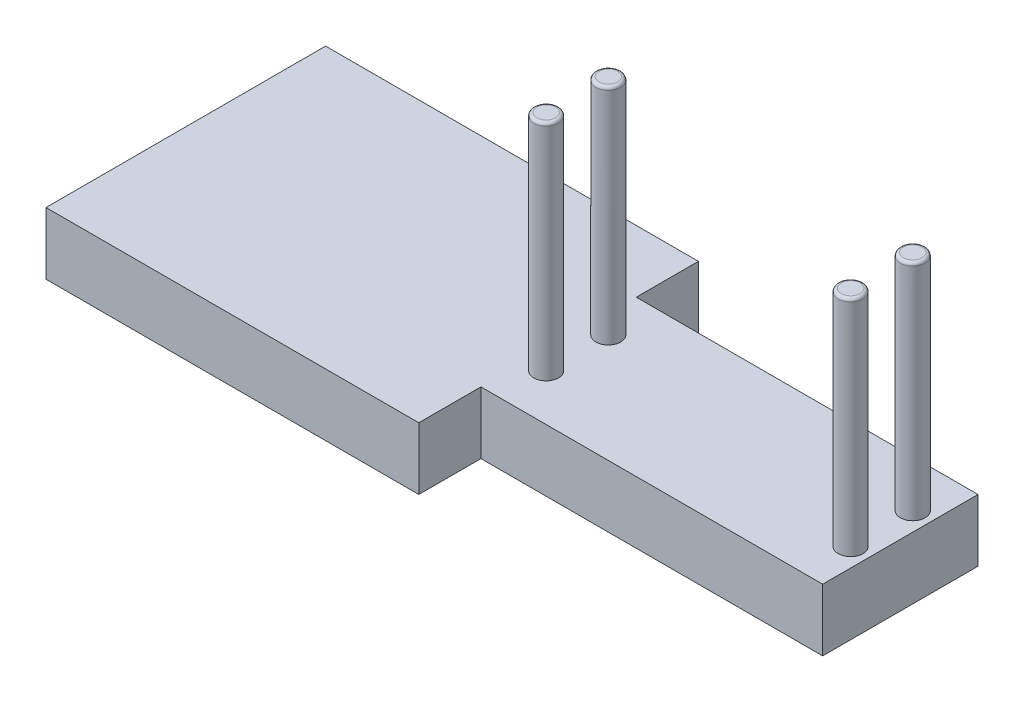
ISO-10303-21;
HEADER;
FILE_DESCRIPTION(('STEP AP214'),'2;1');
FILE_NAME('part.step','',(''),(''),'','','');
FILE_SCHEMA(('AUTOMOTIVE_DESIGN { 1 0 10303 214 1 1 1 1 }'));
ENDSEC;
DATA;
#1=APPLICATION_CONTEXT('core data for automotive mechanical design processes');
#2=APPLICATION_PROTOCOL_DEFINITION('international standard','automotive_design',2000,#1);
#3=PRODUCT_CONTEXT('',#1,'mechanical');
#4=PRODUCT('Part','Part','',(#3));
#5=PRODUCT_RELATED_PRODUCT_CATEGORY('part','',(#4));
#6=PRODUCT_DEFINITION_FORMATION('','',#4);
#7=PRODUCT_DEFINITION_CONTEXT('part definition',#1,'design');
#8=PRODUCT_DEFINITION('design','',#6,#7);
#9=PRODUCT_DEFINITION_SHAPE('','',#8);
#10=(LENGTH_UNIT() NAMED_UNIT(*) SI_UNIT(.MILLI.,.METRE.));
#11=(NAMED_UNIT(*) PLANE_ANGLE_UNIT() SI_UNIT($,.RADIAN.));
#12=(NAMED_UNIT(*) SI_UNIT($,.STERADIAN.) SOLID_ANGLE_UNIT());
#13=UNCERTAINTY_MEASURE_WITH_UNIT(LENGTH_MEASURE(1.E-05),#10,'distance_accuracy_value','');
#14=(GEOMETRIC_REPRESENTATION_CONTEXT(3) GLOBAL_UNCERTAINTY_ASSIGNED_CONTEXT((#13)) GLOBAL_UNIT_ASSIGNED_CONTEXT((#10,
#11,#12)) REPRESENTATION_CONTEXT('',''));
#15=CARTESIAN_POINT('',(0.,0.,0.));
#16=DIRECTION('',(0.,0.,1.));
#17=DIRECTION('',(1.,0.,0.));
#18=AXIS2_PLACEMENT_3D('',#15,#16,#17);
#19=CARTESIAN_POINT('',(-30.,10.,22.5));
#20=DIRECTION('',(0.,0.,-1.));
#21=DIRECTION('',(-1.,0.,0.));
#22=AXIS2_PLACEMENT_3D('',#19,#20,#21);
#23=PLANE('',#22);
#24=DIRECTION('',(1.,0.,0.));
#25=VECTOR('',#24,1.);
#26=CARTESIAN_POINT('',(-30.,0.,22.5));
#27=LINE('',#26,#25);
#28=CARTESIAN_POINT('',(-30.,0.,22.5));
#29=VERTEX_POINT('',#28);
#30=CARTESIAN_POINT('',(30.,0.,22.5));
#31=VERTEX_POINT('',#30);
#32=EDGE_CURVE('E139',#29,#31,#27,.T.);
#33=ORIENTED_EDGE('',*,*,#32,.T.);
#34=DIRECTION('',(0.,-1.,0.));
#35=VECTOR('',#34,1.);
#36=CARTESIAN_POINT('',(30.,10.,22.5));
#37=LINE('',#36,#35);
#38=CARTESIAN_POINT('',(30.,10.,22.5));
#39=VERTEX_POINT('',#38);
#40=EDGE_CURVE('E166',#39,#31,#37,.T.);
#41=ORIENTED_EDGE('',*,*,#40,.F.);
#42=DIRECTION('',(1.,0.,0.));
#43=VECTOR('',#42,1.);
#44=CARTESIAN_POINT('',(-30.,10.,22.5));
#45=LINE('',#44,#43);
#46=CARTESIAN_POINT('',(-30.,10.,22.5));
#47=VERTEX_POINT('',#46);
#48=EDGE_CURVE('E153',#47,#39,#45,.T.);
#49=ORIENTED_EDGE('',*,*,#48,.F.);
#50=DIRECTION('',(0.,-1.,0.));
#51=VECTOR('',#50,1.);
#52=CARTESIAN_POINT('',(-30.,10.,22.5));
#53=LINE('',#52,#51);
#54=EDGE_CURVE('E135',#47,#29,#53,.T.);
#55=ORIENTED_EDGE('',*,*,#54,.T.);
#56=EDGE_LOOP('',(#33,#41,#49,#55));
#57=FACE_BOUND('',#56,.T.);
#58=ADVANCED_FACE('F41',(#57),#23,.F.);
#59=CARTESIAN_POINT('',(30.,10.,12.5));
#60=DIRECTION('',(-1.,0.,0.));
#61=DIRECTION('',(0.,0.,1.));
#62=AXIS2_PLACEMENT_3D('',#59,#60,#61);
#63=PLANE('',#62);
#64=DIRECTION('',(0.,0.,-1.));
#65=VECTOR('',#64,1.);
#66=CARTESIAN_POINT('',(30.,0.,12.5));
#67=LINE('',#66,#65);
#68=CARTESIAN_POINT('',(30.,0.,12.5));
#69=VERTEX_POINT('',#68);
#70=EDGE_CURVE('E142',#31,#69,#67,.T.);
#71=ORIENTED_EDGE('',*,*,#70,.T.);
#72=DIRECTION('',(0.,-1.,0.));
#73=VECTOR('',#72,1.);
#74=CARTESIAN_POINT('',(30.,10.,12.5));
#75=LINE('',#74,#73);
#76=CARTESIAN_POINT('',(30.,10.,12.5));
#77=VERTEX_POINT('',#76);
#78=EDGE_CURVE('E163',#77,#69,#75,.T.);
#79=ORIENTED_EDGE('',*,*,#78,.F.);
#80=DIRECTION('',(0.,0.,-1.));
#81=VECTOR('',#80,1.);
#82=CARTESIAN_POINT('',(30.,10.,12.5));
#83=LINE('',#82,#81);
#84=EDGE_CURVE('E102',#39,#77,#83,.T.);
#85=ORIENTED_EDGE('',*,*,#84,.F.);
#86=ORIENTED_EDGE('',*,*,#40,.T.);
#87=EDGE_LOOP('',(#71,#79,#85,#86));
#88=FACE_BOUND('',#87,.T.);
#89=ADVANCED_FACE('F212',(#88),#63,.F.);
#90=CARTESIAN_POINT('',(30.,10.,12.5));
#91=DIRECTION('',(0.,0.,-1.));
#92=DIRECTION('',(-1.,0.,0.));
#93=AXIS2_PLACEMENT_3D('',#90,#91,#92);
#94=PLANE('',#93);
#95=DIRECTION('',(1.,0.,0.));
#96=VECTOR('',#95,1.);
#97=CARTESIAN_POINT('',(30.,0.,12.5));
#98=LINE('',#97,#96);
#99=CARTESIAN_POINT('',(85.,0.,12.5));
#100=VERTEX_POINT('',#99);
#101=EDGE_CURVE('E144',#69,#100,#98,.T.);
#102=ORIENTED_EDGE('',*,*,#101,.T.);
#103=DIRECTION('',(0.,-1.,0.));
#104=VECTOR('',#103,1.);
#105=CARTESIAN_POINT('',(85.,10.,12.5));
#106=LINE('',#105,#104);
#107=CARTESIAN_POINT('',(85.,10.,12.5));
#108=VERTEX_POINT('',#107);
#109=EDGE_CURVE('E160',#108,#100,#106,.T.);
#110=ORIENTED_EDGE('',*,*,#109,.F.);
#111=DIRECTION('',(1.,0.,0.));
#112=VECTOR('',#111,1.);
#113=CARTESIAN_POINT('',(30.,10.,12.5));
#114=LINE('',#113,#112);
#115=EDGE_CURVE('E285',#77,#108,#114,.T.);
#116=ORIENTED_EDGE('',*,*,#115,.F.);
#117=ORIENTED_EDGE('',*,*,#78,.T.);
#118=EDGE_LOOP('',(#102,#110,#116,#117));
#119=FACE_BOUND('',#118,.T.);
#120=ADVANCED_FACE('F218',(#119),#94,.F.);
#121=CARTESIAN_POINT('',(85.,10.,-12.5));
#122=DIRECTION('',(-1.,0.,0.));
#123=DIRECTION('',(0.,0.,1.));
#124=AXIS2_PLACEMENT_3D('',#121,#122,#123);
#125=PLANE('',#124);
#126=DIRECTION('',(0.,0.,-1.));
#127=VECTOR('',#126,1.);
#128=CARTESIAN_POINT('',(85.,0.,-12.5));
#129=LINE('',#128,#127);
#130=CARTESIAN_POINT('',(85.,0.,-12.5));
#131=VERTEX_POINT('',#130);
#132=EDGE_CURVE('E146',#100,#131,#129,.T.);
#133=ORIENTED_EDGE('',*,*,#132,.T.);
#134=DIRECTION('',(0.,-1.,0.));
#135=VECTOR('',#134,1.);
#136=CARTESIAN_POINT('',(85.,10.,-12.5));
#137=LINE('',#136,#135);
#138=CARTESIAN_POINT('',(85.,10.,-12.5));
#139=VERTEX_POINT('',#138);
#140=EDGE_CURVE('E157',#139,#131,#137,.T.);
#141=ORIENTED_EDGE('',*,*,#140,.F.);
#142=DIRECTION('',(0.,0.,-1.));
#143=VECTOR('',#142,1.);
#144=CARTESIAN_POINT('',(85.,10.,-12.5));
#145=LINE('',#144,#143);
#146=EDGE_CURVE('E282',#108,#139,#145,.T.);
#147=ORIENTED_EDGE('',*,*,#146,.F.);
#148=ORIENTED_EDGE('',*,*,#109,.T.);
#149=EDGE_LOOP('',(#133,#141,#147,#148));
#150=FACE_BOUND('',#149,.T.);
#151=ADVANCED_FACE('F268',(#150),#125,.F.);
#152=CARTESIAN_POINT('',(30.,10.,-12.5));
#153=DIRECTION('',(0.,0.,1.));
#154=DIRECTION('',(1.,0.,0.));
#155=AXIS2_PLACEMENT_3D('',#152,#153,#154);
#156=PLANE('',#155);
#157=DIRECTION('',(-1.,0.,0.));
#158=VECTOR('',#157,1.);
#159=CARTESIAN_POINT('',(30.,0.,-12.5));
#160=LINE('',#159,#158);
#161=CARTESIAN_POINT('',(30.,0.,-12.5));
#162=VERTEX_POINT('',#161);
#163=EDGE_CURVE('E148',#131,#162,#160,.T.);
#164=ORIENTED_EDGE('',*,*,#163,.T.);
#165=DIRECTION('',(0.,-1.,0.));
#166=VECTOR('',#165,1.);
#167=CARTESIAN_POINT('',(30.,10.,-12.5));
#168=LINE('',#167,#166);
#169=CARTESIAN_POINT('',(30.,10.,-12.5));
#170=VERTEX_POINT('',#169);
#171=EDGE_CURVE('E130',#170,#162,#168,.T.);
#172=ORIENTED_EDGE('',*,*,#171,.F.);
#173=DIRECTION('',(-1.,0.,0.));
#174=VECTOR('',#173,1.);
#175=CARTESIAN_POINT('',(30.,10.,-12.5));
#176=LINE('',#175,#174);
#177=EDGE_CURVE('E121',#139,#170,#176,.T.);
#178=ORIENTED_EDGE('',*,*,#177,.F.);
#179=ORIENTED_EDGE('',*,*,#140,.T.);
#180=EDGE_LOOP('',(#164,#172,#178,#179));
#181=FACE_BOUND('',#180,.T.);
#182=ADVANCED_FACE('F265',(#181),#156,.F.);
#183=CARTESIAN_POINT('',(30.,10.,-22.5));
#184=DIRECTION('',(-1.,0.,0.));
#185=DIRECTION('',(0.,0.,1.));
#186=AXIS2_PLACEMENT_3D('',#183,#184,#185);
#187=PLANE('',#186);
#188=DIRECTION('',(0.,0.,-1.));
#189=VECTOR('',#188,1.);
#190=CARTESIAN_POINT('',(30.,0.,-22.5));
#191=LINE('',#190,#189);
#192=CARTESIAN_POINT('',(30.,0.,-22.5));
#193=VERTEX_POINT('',#192);
#194=EDGE_CURVE('E129',#162,#193,#191,.T.);
#195=ORIENTED_EDGE('',*,*,#194,.T.);
#196=DIRECTION('',(0.,-1.,0.));
#197=VECTOR('',#196,1.);
#198=CARTESIAN_POINT('',(30.,10.,-22.5));
#199=LINE('',#198,#197);
#200=CARTESIAN_POINT('',(30.,10.,-22.5));
#201=VERTEX_POINT('',#200);
#202=EDGE_CURVE('E126',#201,#193,#199,.T.);
#203=ORIENTED_EDGE('',*,*,#202,.F.);
#204=DIRECTION('',(0.,0.,-1.));
#205=VECTOR('',#204,1.);
#206=CARTESIAN_POINT('',(30.,10.,-22.5));
#207=LINE('',#206,#205);
#208=EDGE_CURVE('E115',#170,#201,#207,.T.);
#209=ORIENTED_EDGE('',*,*,#208,.F.);
#210=ORIENTED_EDGE('',*,*,#171,.T.);
#211=EDGE_LOOP('',(#195,#203,#209,#210));
#212=FACE_BOUND('',#211,.T.);
#213=ADVANCED_FACE('F127',(#212),#187,.F.);
#214=CARTESIAN_POINT('',(-30.,10.,-22.5));
#215=DIRECTION('',(0.,0.,1.));
#216=DIRECTION('',(1.,0.,0.));
#217=AXIS2_PLACEMENT_3D('',#214,#215,#216);
#218=PLANE('',#217);
#219=DIRECTION('',(-1.,0.,0.));
#220=VECTOR('',#219,1.);
#221=CARTESIAN_POINT('',(-30.,0.,-22.5));
#222=LINE('',#221,#220);
#223=CARTESIAN_POINT('',(-30.,0.,-22.5));
#224=VERTEX_POINT('',#223);
#225=EDGE_CURVE('E87',#193,#224,#222,.T.);
#226=ORIENTED_EDGE('',*,*,#225,.T.);
#227=DIRECTION('',(0.,-1.,0.));
#228=VECTOR('',#227,1.);
#229=CARTESIAN_POINT('',(-30.,10.,-22.5));
#230=LINE('',#229,#228);
#231=CARTESIAN_POINT('',(-30.,10.,-22.5));
#232=VERTEX_POINT('',#231);
#233=EDGE_CURVE('E131',#232,#224,#230,.T.);
#234=ORIENTED_EDGE('',*,*,#233,.F.);
#235=DIRECTION('',(-1.,0.,0.));
#236=VECTOR('',#235,1.);
#237=CARTESIAN_POINT('',(-30.,10.,-22.5));
#238=LINE('',#237,#236);
#239=EDGE_CURVE('E119',#201,#232,#238,.T.);
#240=ORIENTED_EDGE('',*,*,#239,.F.);
#241=ORIENTED_EDGE('',*,*,#202,.T.);
#242=EDGE_LOOP('',(#226,#234,#240,#241));
#243=FACE_BOUND('',#242,.T.);
#244=ADVANCED_FACE('F133',(#243),#218,.F.);
#245=CARTESIAN_POINT('',(-30.,10.,-22.5));
#246=DIRECTION('',(1.,0.,0.));
#247=DIRECTION('',(0.,0.,-1.));
#248=AXIS2_PLACEMENT_3D('',#245,#246,#247);
#249=PLANE('',#248);
#250=DIRECTION('',(0.,0.,1.));
#251=VECTOR('',#250,1.);
#252=CARTESIAN_POINT('',(-30.,0.,-22.5));
#253=LINE('',#252,#251);
#254=EDGE_CURVE('E93',#224,#29,#253,.T.);
#255=ORIENTED_EDGE('',*,*,#254,.T.);
#256=ORIENTED_EDGE('',*,*,#54,.F.);
#257=DIRECTION('',(0.,0.,1.));
#258=VECTOR('',#257,1.);
#259=CARTESIAN_POINT('',(-30.,10.,-22.5));
#260=LINE('',#259,#258);
#261=EDGE_CURVE('E58',#232,#47,#260,.T.);
#262=ORIENTED_EDGE('',*,*,#261,.F.);
#263=ORIENTED_EDGE('',*,*,#233,.T.);
#264=EDGE_LOOP('',(#255,#256,#262,#263));
#265=FACE_BOUND('',#264,.T.);
#266=ADVANCED_FACE('F254',(#265),#249,.F.);
#267=CARTESIAN_POINT('',(0.,10.,0.));
#268=DIRECTION('',(0.,-1.,0.));
#269=DIRECTION('',(0.,0.,-1.));
#270=AXIS2_PLACEMENT_3D('',#267,#268,#269);
#271=PLANE('',#270);
#272=CARTESIAN_POINT('',(82.,10.,5.));
#273=DIRECTION('',(0.,-1.,0.));
#274=DIRECTION('',(0.,0.,-1.));
#275=AXIS2_PLACEMENT_3D('',#272,#273,#274);
#276=CIRCLE('',#275,2.);
#277=CARTESIAN_POINT('',(82.,10.,3.));
#278=VERTEX_POINT('',#277);
#279=EDGE_CURVE('E177',#278,#278,#276,.F.);
#280=ORIENTED_EDGE('',*,*,#279,.F.);
#281=EDGE_LOOP('',(#280));
#282=FACE_BOUND('',#281,.T.);
#283=CARTESIAN_POINT('',(33.,10.,-5.));
#284=DIRECTION('',(0.,-1.,0.));
#285=DIRECTION('',(0.,0.,-1.));
#286=AXIS2_PLACEMENT_3D('',#283,#284,#285);
#287=CIRCLE('',#286,2.);
#288=CARTESIAN_POINT('',(33.,10.,-7.));
#289=VERTEX_POINT('',#288);
#290=EDGE_CURVE('E174',#289,#289,#287,.F.);
#291=ORIENTED_EDGE('',*,*,#290,.F.);
#292=EDGE_LOOP('',(#291));
#293=FACE_BOUND('',#292,.T.);
#294=CARTESIAN_POINT('',(33.,10.,5.));
#295=DIRECTION('',(0.,-1.,0.));
#296=DIRECTION('',(0.,0.,-1.));
#297=AXIS2_PLACEMENT_3D('',#294,#295,#296);
#298=CIRCLE('',#297,2.);
#299=CARTESIAN_POINT('',(33.,10.,3.));
#300=VERTEX_POINT('',#299);
#301=EDGE_CURVE('E171',#300,#300,#298,.F.);
#302=ORIENTED_EDGE('',*,*,#301,.F.);
#303=EDGE_LOOP('',(#302));
#304=FACE_BOUND('',#303,.T.);
#305=CARTESIAN_POINT('',(82.,10.,-5.));
#306=DIRECTION('',(0.,-1.,0.));
#307=DIRECTION('',(0.,0.,-1.));
#308=AXIS2_PLACEMENT_3D('',#305,#306,#307);
#309=CIRCLE('',#308,2.);
#310=CARTESIAN_POINT('',(82.,10.,-7.));
#311=VERTEX_POINT('',#310);
#312=EDGE_CURVE('E168',#311,#311,#309,.F.);
#313=ORIENTED_EDGE('',*,*,#312,.F.);
#314=EDGE_LOOP('',(#313));
#315=FACE_BOUND('',#314,.T.);
#316=ORIENTED_EDGE('',*,*,#48,.T.);
#317=ORIENTED_EDGE('',*,*,#84,.T.);
#318=ORIENTED_EDGE('',*,*,#115,.T.);
#319=ORIENTED_EDGE('',*,*,#146,.T.);
#320=ORIENTED_EDGE('',*,*,#177,.T.);
#321=ORIENTED_EDGE('',*,*,#208,.T.);
#322=ORIENTED_EDGE('',*,*,#239,.T.);
#323=ORIENTED_EDGE('',*,*,#261,.T.);
#324=EDGE_LOOP('',(#316,#317,#318,#319,#320,#321,#322,#323));
#325=FACE_BOUND('',#324,.T.);
#326=ADVANCED_FACE('F117',(#282,#293,#304,#315,#325),#271,.F.);
#327=CARTESIAN_POINT('',(0.,0.,0.));
#328=DIRECTION('',(0.,-1.,0.));
#329=DIRECTION('',(0.,0.,-1.));
#330=AXIS2_PLACEMENT_3D('',#327,#328,#329);
#331=PLANE('',#330);
#332=ORIENTED_EDGE('',*,*,#32,.F.);
#333=ORIENTED_EDGE('',*,*,#254,.F.);
#334=ORIENTED_EDGE('',*,*,#225,.F.);
#335=ORIENTED_EDGE('',*,*,#194,.F.);
#336=ORIENTED_EDGE('',*,*,#163,.F.);
#337=ORIENTED_EDGE('',*,*,#132,.F.);
#338=ORIENTED_EDGE('',*,*,#101,.F.);
#339=ORIENTED_EDGE('',*,*,#70,.F.);
#340=EDGE_LOOP('',(#332,#333,#334,#335,#336,#337,#338,#339));
#341=FACE_BOUND('',#340,.T.);
#342=ADVANCED_FACE('F247',(#341),#331,.T.);
#343=CARTESIAN_POINT('',(82.,46.,-5.));
#344=DIRECTION('',(0.,-1.,0.));
#345=DIRECTION('',(0.,0.,-1.));
#346=AXIS2_PLACEMENT_3D('',#343,#344,#345);
#347=CYLINDRICAL_SURFACE('',#346,2.);
#348=CARTESIAN_POINT('',(82.,45.5,-5.));
#349=DIRECTION('',(0.,1.,0.));
#350=DIRECTION('',(0.,0.,1.));
#351=AXIS2_PLACEMENT_3D('',#348,#349,#350);
#352=CIRCLE('',#351,2.);
#353=CARTESIAN_POINT('',(82.,45.5,-3.));
#354=VERTEX_POINT('',#353);
#355=EDGE_CURVE('E189',#354,#354,#352,.F.);
#356=ORIENTED_EDGE('',*,*,#355,.T.);
#357=EDGE_LOOP('',(#356));
#358=FACE_BOUND('',#357,.T.);
#359=ORIENTED_EDGE('',*,*,#312,.T.);
#360=EDGE_LOOP('',(#359));
#361=FACE_BOUND('',#360,.T.);
#362=ADVANCED_FACE('F238',(#358,#361),#347,.T.);
#363=CARTESIAN_POINT('',(82.,46.,-5.));
#364=DIRECTION('',(0.,1.,0.));
#365=DIRECTION('',(0.,0.,1.));
#366=AXIS2_PLACEMENT_3D('',#363,#364,#365);
#367=PLANE('',#366);
#368=CARTESIAN_POINT('',(82.,46.,-5.));
#369=DIRECTION('',(0.,1.,0.));
#370=DIRECTION('',(0.,0.,1.));
#371=AXIS2_PLACEMENT_3D('',#368,#369,#370);
#372=CIRCLE('',#371,1.5);
#373=CARTESIAN_POINT('',(82.,46.,-3.5));
#374=VERTEX_POINT('',#373);
#375=EDGE_CURVE('E186',#374,#374,#372,.T.);
#376=ORIENTED_EDGE('',*,*,#375,.T.);
#377=EDGE_LOOP('',(#376));
#378=FACE_BOUND('',#377,.T.);
#379=ADVANCED_FACE('F235',(#378),#367,.T.);
#380=CARTESIAN_POINT('',(33.,46.,5.));
#381=DIRECTION('',(0.,-1.,0.));
#382=DIRECTION('',(0.,0.,-1.));
#383=AXIS2_PLACEMENT_3D('',#380,#381,#382);
#384=CYLINDRICAL_SURFACE('',#383,2.);
#385=CARTESIAN_POINT('',(33.,45.5,5.));
#386=DIRECTION('',(0.,1.,0.));
#387=DIRECTION('',(0.,0.,1.));
#388=AXIS2_PLACEMENT_3D('',#385,#386,#387);
#389=CIRCLE('',#388,2.);
#390=CARTESIAN_POINT('',(33.,45.5,7.));
#391=VERTEX_POINT('',#390);
#392=EDGE_CURVE('E195',#391,#391,#389,.F.);
#393=ORIENTED_EDGE('',*,*,#392,.T.);
#394=EDGE_LOOP('',(#393));
#395=FACE_BOUND('',#394,.T.);
#396=ORIENTED_EDGE('',*,*,#301,.T.);
#397=EDGE_LOOP('',(#396));
#398=FACE_BOUND('',#397,.T.);
#399=ADVANCED_FACE('F237',(#395,#398),#384,.T.);
#400=CARTESIAN_POINT('',(33.,46.,5.));
#401=DIRECTION('',(0.,1.,0.));
#402=DIRECTION('',(0.,0.,1.));
#403=AXIS2_PLACEMENT_3D('',#400,#401,#402);
#404=PLANE('',#403);
#405=CARTESIAN_POINT('',(33.,46.,5.));
#406=DIRECTION('',(0.,1.,0.));
#407=DIRECTION('',(0.,0.,1.));
#408=AXIS2_PLACEMENT_3D('',#405,#406,#407);
#409=CIRCLE('',#408,1.5);
#410=CARTESIAN_POINT('',(33.,46.,6.5));
#411=VERTEX_POINT('',#410);
#412=EDGE_CURVE('E192',#411,#411,#409,.T.);
#413=ORIENTED_EDGE('',*,*,#412,.T.);
#414=EDGE_LOOP('',(#413));
#415=FACE_BOUND('',#414,.T.);
#416=ADVANCED_FACE('F244',(#415),#404,.T.);
#417=CARTESIAN_POINT('',(33.,46.,-5.));
#418=DIRECTION('',(0.,-1.,0.));
#419=DIRECTION('',(0.,0.,-1.));
#420=AXIS2_PLACEMENT_3D('',#417,#418,#419);
#421=CYLINDRICAL_SURFACE('',#420,2.);
#422=CARTESIAN_POINT('',(33.,45.5,-5.));
#423=DIRECTION('',(0.,1.,0.));
#424=DIRECTION('',(0.,0.,1.));
#425=AXIS2_PLACEMENT_3D('',#422,#423,#424);
#426=CIRCLE('',#425,2.);
#427=CARTESIAN_POINT('',(33.,45.5,-3.));
#428=VERTEX_POINT('',#427);
#429=EDGE_CURVE('E11',#428,#428,#426,.F.);
#430=ORIENTED_EDGE('',*,*,#429,.T.);
#431=EDGE_LOOP('',(#430));
#432=FACE_BOUND('',#431,.T.);
#433=ORIENTED_EDGE('',*,*,#290,.T.);
#434=EDGE_LOOP('',(#433));
#435=FACE_BOUND('',#434,.T.);
#436=ADVANCED_FACE('F349',(#432,#435),#421,.T.);
#437=CARTESIAN_POINT('',(33.,46.,-5.));
#438=DIRECTION('',(0.,1.,0.));
#439=DIRECTION('',(0.,0.,1.));
#440=AXIS2_PLACEMENT_3D('',#437,#438,#439);
#441=PLANE('',#440);
#442=CARTESIAN_POINT('',(33.,46.,-5.));
#443=DIRECTION('',(0.,1.,0.));
#444=DIRECTION('',(0.,0.,1.));
#445=AXIS2_PLACEMENT_3D('',#442,#443,#444);
#446=CIRCLE('',#445,1.5);
#447=CARTESIAN_POINT('',(33.,46.,-3.5));
#448=VERTEX_POINT('',#447);
#449=EDGE_CURVE('E50',#448,#448,#446,.T.);
#450=ORIENTED_EDGE('',*,*,#449,.T.);
#451=EDGE_LOOP('',(#450));
#452=FACE_BOUND('',#451,.T.);
#453=ADVANCED_FACE('F200',(#452),#441,.T.);
#454=CARTESIAN_POINT('',(82.,46.,5.));
#455=DIRECTION('',(0.,-1.,0.));
#456=DIRECTION('',(0.,0.,-1.));
#457=AXIS2_PLACEMENT_3D('',#454,#455,#456);
#458=CYLINDRICAL_SURFACE('',#457,2.);
#459=CARTESIAN_POINT('',(82.,45.5,5.));
#460=DIRECTION('',(0.,1.,0.));
#461=DIRECTION('',(0.,0.,1.));
#462=AXIS2_PLACEMENT_3D('',#459,#460,#461);
#463=CIRCLE('',#462,2.);
#464=CARTESIAN_POINT('',(82.,45.5,7.));
#465=VERTEX_POINT('',#464);
#466=EDGE_CURVE('E183',#465,#465,#463,.F.);
#467=ORIENTED_EDGE('',*,*,#466,.T.);
#468=EDGE_LOOP('',(#467));
#469=FACE_BOUND('',#468,.T.);
#470=ORIENTED_EDGE('',*,*,#279,.T.);
#471=EDGE_LOOP('',(#470));
#472=FACE_BOUND('',#471,.T.);
#473=ADVANCED_FACE('F329',(#469,#472),#458,.T.);
#474=CARTESIAN_POINT('',(82.,46.,5.));
#475=DIRECTION('',(0.,1.,0.));
#476=DIRECTION('',(0.,0.,1.));
#477=AXIS2_PLACEMENT_3D('',#474,#475,#476);
#478=PLANE('',#477);
#479=CARTESIAN_POINT('',(82.,46.,5.));
#480=DIRECTION('',(0.,1.,0.));
#481=DIRECTION('',(0.,0.,1.));
#482=AXIS2_PLACEMENT_3D('',#479,#480,#481);
#483=CIRCLE('',#482,1.5);
#484=CARTESIAN_POINT('',(82.,46.,6.5));
#485=VERTEX_POINT('',#484);
#486=EDGE_CURVE('E180',#485,#485,#483,.T.);
#487=ORIENTED_EDGE('',*,*,#486,.T.);
#488=EDGE_LOOP('',(#487));
#489=FACE_BOUND('',#488,.T.);
#490=ADVANCED_FACE('F225',(#489),#478,.T.);
#491=CARTESIAN_POINT('',(82.,45.5,5.));
#492=DIRECTION('',(0.,1.,0.));
#493=DIRECTION('',(0.,0.,1.));
#494=AXIS2_PLACEMENT_3D('',#491,#492,#493);
#495=TOROIDAL_SURFACE('',#494,1.5,0.5);
#496=ORIENTED_EDGE('',*,*,#466,.F.);
#497=EDGE_LOOP('',(#496));
#498=FACE_BOUND('',#497,.T.);
#499=ORIENTED_EDGE('',*,*,#486,.F.);
#500=EDGE_LOOP('',(#499));
#501=FACE_BOUND('',#500,.T.);
#502=ADVANCED_FACE('F222',(#498,#501),#495,.T.);
#503=CARTESIAN_POINT('',(82.,45.5,-5.));
#504=DIRECTION('',(0.,1.,0.));
#505=DIRECTION('',(0.,0.,1.));
#506=AXIS2_PLACEMENT_3D('',#503,#504,#505);
#507=TOROIDAL_SURFACE('',#506,1.5,0.5);
#508=ORIENTED_EDGE('',*,*,#355,.F.);
#509=EDGE_LOOP('',(#508));
#510=FACE_BOUND('',#509,.T.);
#511=ORIENTED_EDGE('',*,*,#375,.F.);
#512=EDGE_LOOP('',(#511));
#513=FACE_BOUND('',#512,.T.);
#514=ADVANCED_FACE('F208',(#510,#513),#507,.T.);
#515=CARTESIAN_POINT('',(33.,45.5,5.));
#516=DIRECTION('',(0.,1.,0.));
#517=DIRECTION('',(0.,0.,1.));
#518=AXIS2_PLACEMENT_3D('',#515,#516,#517);
#519=TOROIDAL_SURFACE('',#518,1.5,0.5);
#520=ORIENTED_EDGE('',*,*,#392,.F.);
#521=EDGE_LOOP('',(#520));
#522=FACE_BOUND('',#521,.T.);
#523=ORIENTED_EDGE('',*,*,#412,.F.);
#524=EDGE_LOOP('',(#523));
#525=FACE_BOUND('',#524,.T.);
#526=ADVANCED_FACE('F203',(#522,#525),#519,.T.);
#527=CARTESIAN_POINT('',(33.,45.5,-5.));
#528=DIRECTION('',(0.,1.,0.));
#529=DIRECTION('',(0.,0.,1.));
#530=AXIS2_PLACEMENT_3D('',#527,#528,#529);
#531=TOROIDAL_SURFACE('',#530,1.5,0.5);
#532=ORIENTED_EDGE('',*,*,#429,.F.);
#533=EDGE_LOOP('',(#532));
#534=FACE_BOUND('',#533,.T.);
#535=ORIENTED_EDGE('',*,*,#449,.F.);
#536=EDGE_LOOP('',(#535));
#537=FACE_BOUND('',#536,.T.);
#538=ADVANCED_FACE('F43',(#534,#537),#531,.T.);
#539=CLOSED_SHELL('',(#58,#89,#120,#151,#182,#213,#244,#266,#326,#342,#362,#379,#399,#416,#436,
#453,#473,#490,#502,#514,#526,#538));
#540=MANIFOLD_SOLID_BREP('B2',#539);
#541=ADVANCED_BREP_SHAPE_REPRESENTATION('',(#18,#540),#14);
#542=SHAPE_DEFINITION_REPRESENTATION(#9,#541);
ENDSEC;
END-ISO-10303-21;
